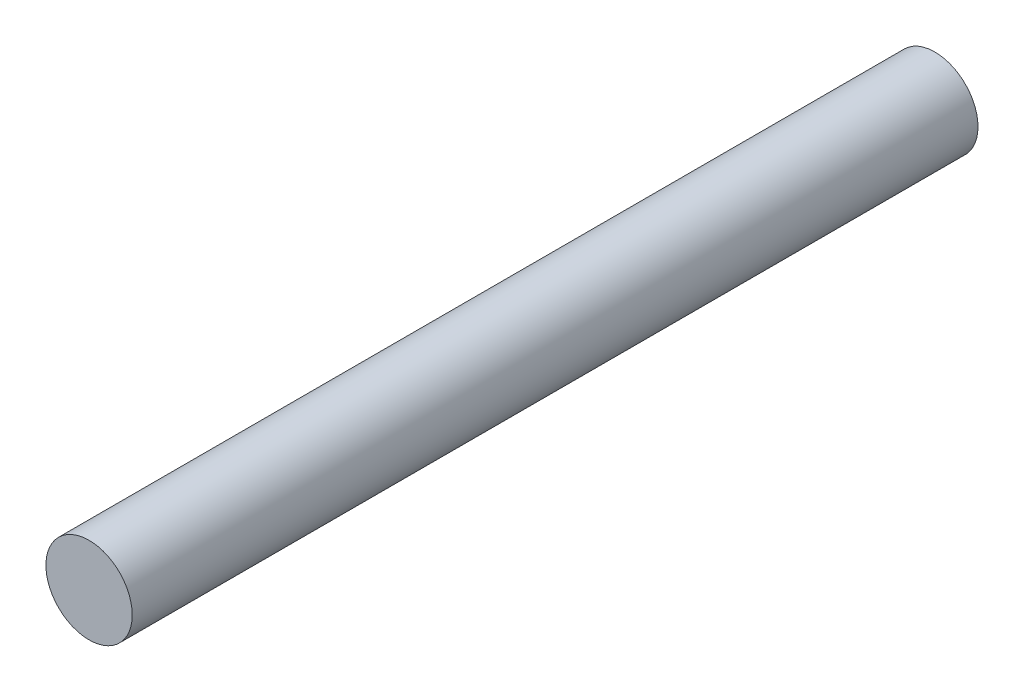
ISO-10303-21;
HEADER;
FILE_DESCRIPTION(('STEP AP214'),'2;1');
FILE_NAME('part.step','',(''),(''),'','','');
FILE_SCHEMA(('AUTOMOTIVE_DESIGN { 1 0 10303 214 1 1 1 1 }'));
ENDSEC;
DATA;
#1=APPLICATION_CONTEXT('core data for automotive mechanical design processes');
#2=APPLICATION_PROTOCOL_DEFINITION('international standard','automotive_design',2000,#1);
#3=PRODUCT_CONTEXT('',#1,'mechanical');
#4=PRODUCT('Part','Part','',(#3));
#5=PRODUCT_RELATED_PRODUCT_CATEGORY('part','',(#4));
#6=PRODUCT_DEFINITION_FORMATION('','',#4);
#7=PRODUCT_DEFINITION_CONTEXT('part definition',#1,'design');
#8=PRODUCT_DEFINITION('design','',#6,#7);
#9=PRODUCT_DEFINITION_SHAPE('','',#8);
#10=(LENGTH_UNIT() NAMED_UNIT(*) SI_UNIT(.MILLI.,.METRE.));
#11=(NAMED_UNIT(*) PLANE_ANGLE_UNIT() SI_UNIT($,.RADIAN.));
#12=(NAMED_UNIT(*) SI_UNIT($,.STERADIAN.) SOLID_ANGLE_UNIT());
#13=UNCERTAINTY_MEASURE_WITH_UNIT(LENGTH_MEASURE(1.E-05),#10,'distance_accuracy_value','');
#14=(GEOMETRIC_REPRESENTATION_CONTEXT(3) GLOBAL_UNCERTAINTY_ASSIGNED_CONTEXT((#13)) GLOBAL_UNIT_ASSIGNED_CONTEXT((#10,
#11,#12)) REPRESENTATION_CONTEXT('',''));
#15=CARTESIAN_POINT('',(0.,0.,0.));
#16=DIRECTION('',(0.,0.,1.));
#17=DIRECTION('',(1.,0.,0.));
#18=AXIS2_PLACEMENT_3D('',#15,#16,#17);
#19=CARTESIAN_POINT('',(0.,0.,98.));
#20=DIRECTION('',(0.,0.,-1.));
#21=DIRECTION('',(-1.,0.,0.));
#22=AXIS2_PLACEMENT_3D('',#19,#20,#21);
#23=CYLINDRICAL_SURFACE('',#22,5.);
#24=CARTESIAN_POINT('',(0.,0.,98.));
#25=DIRECTION('',(0.,0.,1.));
#26=DIRECTION('',(1.,0.,0.));
#27=AXIS2_PLACEMENT_3D('',#24,#25,#26);
#28=CIRCLE('',#27,5.);
#29=CARTESIAN_POINT('',(5.,0.,98.));
#30=VERTEX_POINT('',#29);
#31=EDGE_CURVE('E10',#30,#30,#28,.T.);
#32=ORIENTED_EDGE('',*,*,#31,.F.);
#33=EDGE_LOOP('',(#32));
#34=FACE_BOUND('',#33,.T.);
#35=CARTESIAN_POINT('',(0.,0.,0.));
#36=DIRECTION('',(0.,0.,1.));
#37=DIRECTION('',(1.,0.,0.));
#38=AXIS2_PLACEMENT_3D('',#35,#36,#37);
#39=CIRCLE('',#38,5.);
#40=CARTESIAN_POINT('',(5.,0.,0.));
#41=VERTEX_POINT('',#40);
#42=EDGE_CURVE('E40',#41,#41,#39,.T.);
#43=ORIENTED_EDGE('',*,*,#42,.T.);
#44=EDGE_LOOP('',(#43));
#45=FACE_BOUND('',#44,.T.);
#46=ADVANCED_FACE('F37',(#34,#45),#23,.T.);
#47=CARTESIAN_POINT('',(0.,0.,98.));
#48=DIRECTION('',(0.,0.,1.));
#49=DIRECTION('',(1.,0.,0.));
#50=AXIS2_PLACEMENT_3D('',#47,#48,#49);
#51=PLANE('',#50);
#52=ORIENTED_EDGE('',*,*,#31,.T.);
#53=EDGE_LOOP('',(#52));
#54=FACE_BOUND('',#53,.T.);
#55=ADVANCED_FACE('F54',(#54),#51,.T.);
#56=CARTESIAN_POINT('',(0.,0.,0.));
#57=DIRECTION('',(0.,0.,1.));
#58=DIRECTION('',(1.,0.,0.));
#59=AXIS2_PLACEMENT_3D('',#56,#57,#58);
#60=PLANE('',#59);
#61=ORIENTED_EDGE('',*,*,#42,.F.);
#62=EDGE_LOOP('',(#61));
#63=FACE_BOUND('',#62,.T.);
#64=ADVANCED_FACE('F52',(#63),#60,.F.);
#65=CLOSED_SHELL('',(#46,#55,#64));
#66=MANIFOLD_SOLID_BREP('B2',#65);
#67=ADVANCED_BREP_SHAPE_REPRESENTATION('',(#18,#66),#14);
#68=SHAPE_DEFINITION_REPRESENTATION(#9,#67);
ENDSEC;
END-ISO-10303-21;
